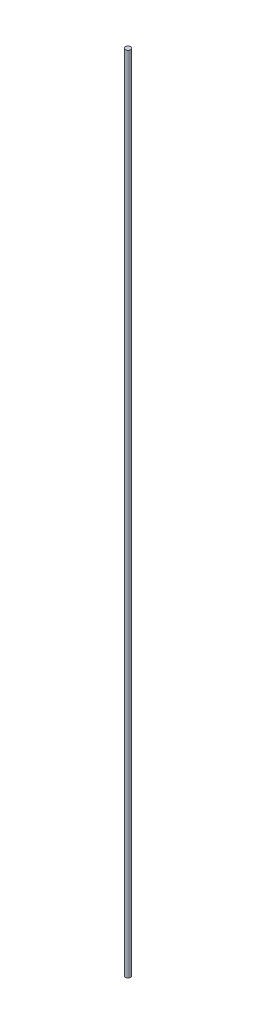
ISO-10303-21;
HEADER;
FILE_DESCRIPTION(('STEP AP214'),'2;1');
FILE_NAME('part.step','',(''),(''),'','','');
FILE_SCHEMA(('AUTOMOTIVE_DESIGN { 1 0 10303 214 1 1 1 1 }'));
ENDSEC;
DATA;
#1=APPLICATION_CONTEXT('core data for automotive mechanical design processes');
#2=APPLICATION_PROTOCOL_DEFINITION('international standard','automotive_design',2000,#1);
#3=PRODUCT_CONTEXT('',#1,'mechanical');
#4=PRODUCT('Part','Part','',(#3));
#5=PRODUCT_RELATED_PRODUCT_CATEGORY('part','',(#4));
#6=PRODUCT_DEFINITION_FORMATION('','',#4);
#7=PRODUCT_DEFINITION_CONTEXT('part definition',#1,'design');
#8=PRODUCT_DEFINITION('design','',#6,#7);
#9=PRODUCT_DEFINITION_SHAPE('','',#8);
#10=(LENGTH_UNIT() NAMED_UNIT(*) SI_UNIT(.MILLI.,.METRE.));
#11=(NAMED_UNIT(*) PLANE_ANGLE_UNIT() SI_UNIT($,.RADIAN.));
#12=(NAMED_UNIT(*) SI_UNIT($,.STERADIAN.) SOLID_ANGLE_UNIT());
#13=UNCERTAINTY_MEASURE_WITH_UNIT(LENGTH_MEASURE(1.E-05),#10,'distance_accuracy_value','');
#14=(GEOMETRIC_REPRESENTATION_CONTEXT(3) GLOBAL_UNCERTAINTY_ASSIGNED_CONTEXT((#13)) GLOBAL_UNIT_ASSIGNED_CONTEXT((#10,
#11,#12)) REPRESENTATION_CONTEXT('',''));
#15=CARTESIAN_POINT('',(0.,0.,0.));
#16=DIRECTION('',(0.,0.,1.));
#17=DIRECTION('',(1.,0.,0.));
#18=AXIS2_PLACEMENT_3D('',#15,#16,#17);
#19=CARTESIAN_POINT('',(-2.50000000000001,380.,0.));
#20=DIRECTION('',(0.,1.,0.));
#21=DIRECTION('',(-1.,0.,0.));
#22=AXIS2_PLACEMENT_3D('',#19,#20,#21);
#23=CYLINDRICAL_SURFACE('',#22,2.5);
#24=CARTESIAN_POINT('',(-2.50000000000001,380.,0.));
#25=DIRECTION('',(0.,1.,0.));
#26=DIRECTION('',(-1.,0.,0.));
#27=AXIS2_PLACEMENT_3D('',#24,#25,#26);
#28=CIRCLE('',#27,2.5);
#29=CARTESIAN_POINT('',(-5.00000000000001,380.,0.));
#30=VERTEX_POINT('',#29);
#31=EDGE_CURVE('E10',#30,#30,#28,.T.);
#32=ORIENTED_EDGE('',*,*,#31,.F.);
#33=EDGE_LOOP('',(#32));
#34=FACE_BOUND('',#33,.T.);
#35=CARTESIAN_POINT('',(-2.50000000000001,-380.,0.));
#36=DIRECTION('',(0.,1.,0.));
#37=DIRECTION('',(-1.,0.,0.));
#38=AXIS2_PLACEMENT_3D('',#35,#36,#37);
#39=CIRCLE('',#38,2.5);
#40=CARTESIAN_POINT('',(-5.00000000000001,-380.,0.));
#41=VERTEX_POINT('',#40);
#42=EDGE_CURVE('E43',#41,#41,#39,.T.);
#43=ORIENTED_EDGE('',*,*,#42,.T.);
#44=EDGE_LOOP('',(#43));
#45=FACE_BOUND('',#44,.T.);
#46=ADVANCED_FACE('F37',(#34,#45),#23,.T.);
#47=CARTESIAN_POINT('',(-2.50000000000001,380.,0.));
#48=DIRECTION('',(0.,-1.,0.));
#49=DIRECTION('',(1.,0.,0.));
#50=AXIS2_PLACEMENT_3D('',#47,#48,#49);
#51=PLANE('',#50);
#52=ORIENTED_EDGE('',*,*,#31,.T.);
#53=EDGE_LOOP('',(#52));
#54=FACE_BOUND('',#53,.T.);
#55=ADVANCED_FACE('F52',(#54),#51,.F.);
#56=CARTESIAN_POINT('',(-2.50000000000001,-380.,0.));
#57=DIRECTION('',(0.,1.,0.));
#58=DIRECTION('',(-1.,0.,0.));
#59=AXIS2_PLACEMENT_3D('',#56,#57,#58);
#60=PLANE('',#59);
#61=ORIENTED_EDGE('',*,*,#42,.F.);
#62=EDGE_LOOP('',(#61));
#63=FACE_BOUND('',#62,.T.);
#64=ADVANCED_FACE('F50',(#63),#60,.F.);
#65=CLOSED_SHELL('',(#46,#55,#64));
#66=MANIFOLD_SOLID_BREP('B2',#65);
#67=ADVANCED_BREP_SHAPE_REPRESENTATION('',(#18,#66),#14);
#68=SHAPE_DEFINITION_REPRESENTATION(#9,#67);
ENDSEC;
END-ISO-10303-21;
